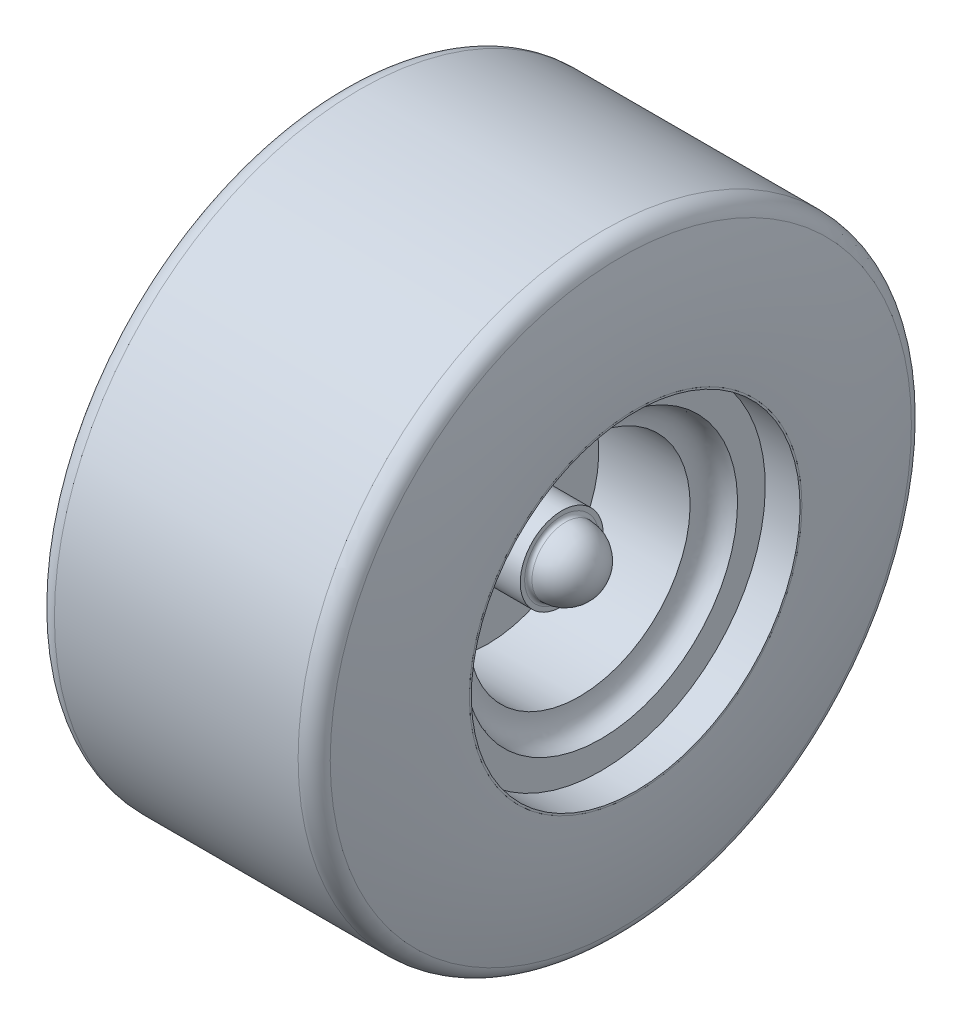
ISO-10303-21;
HEADER;
FILE_DESCRIPTION(('STEP AP214'),'2;1');
FILE_NAME('part.step','',(''),(''),'','','');
FILE_SCHEMA(('AUTOMOTIVE_DESIGN { 1 0 10303 214 1 1 1 1 }'));
ENDSEC;
DATA;
#1=APPLICATION_CONTEXT('core data for automotive mechanical design processes');
#2=APPLICATION_PROTOCOL_DEFINITION('international standard','automotive_design',2000,#1);
#3=PRODUCT_CONTEXT('',#1,'mechanical');
#4=PRODUCT('Part','Part','',(#3));
#5=PRODUCT_RELATED_PRODUCT_CATEGORY('part','',(#4));
#6=PRODUCT_DEFINITION_FORMATION('','',#4);
#7=PRODUCT_DEFINITION_CONTEXT('part definition',#1,'design');
#8=PRODUCT_DEFINITION('design','',#6,#7);
#9=PRODUCT_DEFINITION_SHAPE('','',#8);
#10=(LENGTH_UNIT() NAMED_UNIT(*) SI_UNIT(.MILLI.,.METRE.));
#11=(NAMED_UNIT(*) PLANE_ANGLE_UNIT() SI_UNIT($,.RADIAN.));
#12=(NAMED_UNIT(*) SI_UNIT($,.STERADIAN.) SOLID_ANGLE_UNIT());
#13=UNCERTAINTY_MEASURE_WITH_UNIT(LENGTH_MEASURE(1.E-05),#10,'distance_accuracy_value','');
#14=(GEOMETRIC_REPRESENTATION_CONTEXT(3) GLOBAL_UNCERTAINTY_ASSIGNED_CONTEXT((#13)) GLOBAL_UNIT_ASSIGNED_CONTEXT((#10,
#11,#12)) REPRESENTATION_CONTEXT('',''));
#15=CARTESIAN_POINT('',(0.,0.,0.));
#16=DIRECTION('',(0.,0.,1.));
#17=DIRECTION('',(1.,0.,0.));
#18=AXIS2_PLACEMENT_3D('',#15,#16,#17);
#19=CARTESIAN_POINT('',(-80.9625,0.,0.));
#20=DIRECTION('',(1.,0.,0.));
#21=DIRECTION('',(0.,0.,-1.));
#22=AXIS2_PLACEMENT_3D('',#19,#20,#21);
#23=CYLINDRICAL_SURFACE('',#22,19.05);
#24=CARTESIAN_POINT('',(-80.9625,0.,0.));
#25=DIRECTION('',(-1.,0.,0.));
#26=DIRECTION('',(0.,0.,1.));
#27=AXIS2_PLACEMENT_3D('',#24,#25,#26);
#28=CIRCLE('',#27,19.05);
#29=CARTESIAN_POINT('',(-80.9625,0.,19.05));
#30=VERTEX_POINT('',#29);
#31=EDGE_CURVE('E11',#30,#30,#28,.T.);
#32=ORIENTED_EDGE('',*,*,#31,.F.);
#33=EDGE_LOOP('',(#32));
#34=FACE_BOUND('',#33,.T.);
#35=CARTESIAN_POINT('',(-17.4625,0.,0.));
#36=DIRECTION('',(-1.,0.,0.));
#37=DIRECTION('',(0.,0.,1.));
#38=AXIS2_PLACEMENT_3D('',#35,#36,#37);
#39=CIRCLE('',#38,19.05);
#40=CARTESIAN_POINT('',(-17.4625,0.,19.05));
#41=VERTEX_POINT('',#40);
#42=EDGE_CURVE('E44',#41,#41,#39,.T.);
#43=ORIENTED_EDGE('',*,*,#42,.T.);
#44=EDGE_LOOP('',(#43));
#45=FACE_BOUND('',#44,.T.);
#46=ADVANCED_FACE('F41',(#34,#45),#23,.T.);
#47=CARTESIAN_POINT('',(-80.9625,0.,0.));
#48=DIRECTION('',(-1.,0.,0.));
#49=DIRECTION('',(0.,0.,1.));
#50=AXIS2_PLACEMENT_3D('',#47,#48,#49);
#51=PLANE('',#50);
#52=ORIENTED_EDGE('',*,*,#31,.T.);
#53=EDGE_LOOP('',(#52));
#54=FACE_BOUND('',#53,.T.);
#55=ADVANCED_FACE('F56',(#54),#51,.T.);
#56=CARTESIAN_POINT('',(-17.4625,0.,0.));
#57=DIRECTION('',(-1.,0.,0.));
#58=DIRECTION('',(0.,0.,1.));
#59=AXIS2_PLACEMENT_3D('',#56,#57,#58);
#60=PLANE('',#59);
#61=ORIENTED_EDGE('',*,*,#42,.F.);
#62=EDGE_LOOP('',(#61));
#63=FACE_BOUND('',#62,.T.);
#64=ADVANCED_FACE('F54',(#63),#60,.F.);
#65=CLOSED_SHELL('',(#46,#55,#64));
#66=MANIFOLD_SOLID_BREP('B2',#65);
#67=CARTESIAN_POINT('',(55.5625,0.,0.));
#68=DIRECTION('',(1.,0.,0.));
#69=DIRECTION('',(0.,1.,0.));
#70=AXIS2_PLACEMENT_3D('',#67,#68,#69);
#71=PLANE('',#70);
#72=CARTESIAN_POINT('',(55.5625,0.,0.));
#73=DIRECTION('',(1.,0.,0.));
#74=DIRECTION('',(0.,1.,0.));
#75=AXIS2_PLACEMENT_3D('',#72,#73,#74);
#76=CIRCLE('',#75,25.5647473352489);
#77=CARTESIAN_POINT('',(55.5625,25.5647473352489,0.));
#78=VERTEX_POINT('',#77);
#79=EDGE_CURVE('E40',#78,#78,#76,.F.);
#80=ORIENTED_EDGE('',*,*,#79,.T.);
#81=EDGE_LOOP('',(#80));
#82=FACE_BOUND('',#81,.T.);
#83=CARTESIAN_POINT('',(55.5625,0.,0.));
#84=DIRECTION('',(1.,0.,0.));
#85=DIRECTION('',(0.,1.,0.));
#86=AXIS2_PLACEMENT_3D('',#83,#84,#85);
#87=CIRCLE('',#86,28.575);
#88=CARTESIAN_POINT('',(55.5625,28.575,0.));
#89=VERTEX_POINT('',#88);
#90=EDGE_CURVE('E96',#89,#89,#87,.T.);
#91=ORIENTED_EDGE('',*,*,#90,.T.);
#92=EDGE_LOOP('',(#91));
#93=FACE_BOUND('',#92,.T.);
#94=ADVANCED_FACE('F89',(#82,#93),#71,.T.);
#95=CARTESIAN_POINT('',(55.5625,0.,0.));
#96=DIRECTION('',(-1.,0.,0.));
#97=DIRECTION('',(0.,-1.,0.));
#98=AXIS2_PLACEMENT_3D('',#95,#96,#97);
#99=CYLINDRICAL_SURFACE('',#98,28.575);
#100=ORIENTED_EDGE('',*,*,#90,.F.);
#101=EDGE_LOOP('',(#100));
#102=FACE_BOUND('',#101,.T.);
#103=CARTESIAN_POINT('',(4.7625,0.,0.));
#104=DIRECTION('',(1.,0.,0.));
#105=DIRECTION('',(0.,1.,0.));
#106=AXIS2_PLACEMENT_3D('',#103,#104,#105);
#107=CIRCLE('',#106,28.575);
#108=CARTESIAN_POINT('',(4.7625,28.575,0.));
#109=VERTEX_POINT('',#108);
#110=EDGE_CURVE('E100',#109,#109,#107,.T.);
#111=ORIENTED_EDGE('',*,*,#110,.T.);
#112=EDGE_LOOP('',(#111));
#113=FACE_BOUND('',#112,.T.);
#114=ADVANCED_FACE('F119',(#102,#113),#99,.T.);
#115=CARTESIAN_POINT('',(4.7625,0.,0.));
#116=DIRECTION('',(1.,0.,0.));
#117=DIRECTION('',(0.,1.,0.));
#118=AXIS2_PLACEMENT_3D('',#115,#116,#117);
#119=PLANE('',#118);
#120=ORIENTED_EDGE('',*,*,#110,.F.);
#121=EDGE_LOOP('',(#120));
#122=FACE_BOUND('',#121,.T.);
#123=ADVANCED_FACE('F117',(#122),#119,.F.);
#124=CARTESIAN_POINT('',(57.9371590146096,0.,0.));
#125=DIRECTION('',(0.,0.,1.));
#126=DIRECTION('',(1.,0.,0.));
#127=AXIS2_PLACEMENT_3D('',#124,#125,#126);
#128=SPHERICAL_SURFACE('',#127,23.0253409853904);
#129=CARTESIAN_POINT('',(57.9371590146096,0.,0.));
#130=DIRECTION('',(1.,0.,0.));
#131=DIRECTION('',(0.,1.,0.));
#132=AXIS2_PLACEMENT_3D('',#129,#130,#131);
#133=SPHERICAL_SURFACE('',#132,23.0253409853904);
#134=CARTESIAN_POINT('',(58.1025,0.,0.));
#135=DIRECTION('',(1.,0.,0.));
#136=DIRECTION('',(0.,1.,0.));
#137=AXIS2_PLACEMENT_3D('',#134,#135,#136);
#138=CIRCLE('',#137,23.0247473352489);
#139=CARTESIAN_POINT('',(58.1025,23.0247473352489,0.));
#140=VERTEX_POINT('',#139);
#141=EDGE_CURVE('E105',#140,#140,#138,.T.);
#142=ORIENTED_EDGE('',*,*,#141,.T.);
#143=EDGE_LOOP('',(#142));
#144=FACE_BOUND('',#143,.T.);
#145=ADVANCED_FACE('F110',(#144),#133,.T.);
#146=CARTESIAN_POINT('',(58.1025,0.,0.));
#147=DIRECTION('',(1.,0.,0.));
#148=DIRECTION('',(0.,1.,0.));
#149=AXIS2_PLACEMENT_3D('',#146,#147,#148);
#150=TOROIDAL_SURFACE('',#149,25.5647473352489,2.54);
#151=ORIENTED_EDGE('',*,*,#79,.F.);
#152=EDGE_LOOP('',(#151));
#153=FACE_BOUND('',#152,.T.);
#154=ORIENTED_EDGE('',*,*,#141,.F.);
#155=EDGE_LOOP('',(#154));
#156=FACE_BOUND('',#155,.T.);
#157=ADVANCED_FACE('F91',(#153,#156),#150,.F.);
#158=CLOSED_SHELL('',(#94,#114,#123,#145,#157));
#159=MANIFOLD_SOLID_BREP('B6',#158);
#160=CARTESIAN_POINT('',(-17.4625,0.,0.));
#161=DIRECTION('',(-1.,0.,0.));
#162=DIRECTION('',(0.,0.,1.));
#163=AXIS2_PLACEMENT_3D('',#160,#161,#162);
#164=PLANE('',#163);
#165=CARTESIAN_POINT('',(-17.4625,0.,0.));
#166=DIRECTION('',(1.,0.,0.));
#167=DIRECTION('',(0.,0.,-1.));
#168=AXIS2_PLACEMENT_3D('',#165,#166,#167);
#169=CIRCLE('',#168,96.9151830966365);
#170=CARTESIAN_POINT('',(-17.4625,0.,-96.9151830966365));
#171=VERTEX_POINT('',#170);
#172=EDGE_CURVE('E88',#171,#171,#169,.T.);
#173=ORIENTED_EDGE('',*,*,#172,.F.);
#174=EDGE_LOOP('',(#173));
#175=FACE_BOUND('',#174,.T.);
#176=ADVANCED_FACE('F166',(#175),#164,.T.);
#177=CARTESIAN_POINT('',(0.,0.,0.));
#178=DIRECTION('',(1.,0.,0.));
#179=DIRECTION('',(0.,0.,-1.));
#180=AXIS2_PLACEMENT_3D('',#177,#178,#179);
#181=CYLINDRICAL_SURFACE('',#180,96.9151830966365);
#182=ORIENTED_EDGE('',*,*,#172,.T.);
#183=EDGE_LOOP('',(#182));
#184=FACE_BOUND('',#183,.T.);
#185=CARTESIAN_POINT('',(-90.2476830966366,0.,0.));
#186=DIRECTION('',(1.,0.,0.));
#187=DIRECTION('',(0.,0.,-1.));
#188=AXIS2_PLACEMENT_3D('',#185,#186,#187);
#189=CIRCLE('',#188,96.9151830966365);
#190=CARTESIAN_POINT('',(-90.2476830966366,0.,-96.9151830966365));
#191=VERTEX_POINT('',#190);
#192=EDGE_CURVE('E172',#191,#191,#189,.T.);
#193=ORIENTED_EDGE('',*,*,#192,.F.);
#194=EDGE_LOOP('',(#193));
#195=FACE_BOUND('',#194,.T.);
#196=ADVANCED_FACE('F246',(#184,#195),#181,.F.);
#197=CARTESIAN_POINT('',(-101.760694514085,0.,0.));
#198=DIRECTION('',(-1.,0.,0.));
#199=DIRECTION('',(0.,0.,1.));
#200=AXIS2_PLACEMENT_3D('',#197,#198,#199);
#201=CONICAL_SURFACE('',#200,113.03,0.950447084238589);
#202=ORIENTED_EDGE('',*,*,#192,.T.);
#203=EDGE_LOOP('',(#202));
#204=FACE_BOUND('',#203,.T.);
#205=CARTESIAN_POINT('',(-101.760694514085,0.,0.));
#206=DIRECTION('',(1.,0.,0.));
#207=DIRECTION('',(0.,0.,-1.));
#208=AXIS2_PLACEMENT_3D('',#205,#206,#207);
#209=CIRCLE('',#208,113.03);
#210=CARTESIAN_POINT('',(-101.760694514085,0.,-113.03));
#211=VERTEX_POINT('',#210);
#212=EDGE_CURVE('E176',#211,#211,#209,.T.);
#213=ORIENTED_EDGE('',*,*,#212,.F.);
#214=EDGE_LOOP('',(#213));
#215=FACE_BOUND('',#214,.T.);
#216=ADVANCED_FACE('F243',(#204,#215),#201,.F.);
#217=CARTESIAN_POINT('',(0.,0.,0.));
#218=DIRECTION('',(1.,0.,0.));
#219=DIRECTION('',(0.,0.,-1.));
#220=AXIS2_PLACEMENT_3D('',#217,#218,#219);
#221=CYLINDRICAL_SURFACE('',#220,113.03);
#222=ORIENTED_EDGE('',*,*,#212,.T.);
#223=EDGE_LOOP('',(#222));
#224=FACE_BOUND('',#223,.T.);
#225=CARTESIAN_POINT('',(-106.3625,0.,0.));
#226=DIRECTION('',(1.,0.,0.));
#227=DIRECTION('',(0.,0.,-1.));
#228=AXIS2_PLACEMENT_3D('',#225,#226,#227);
#229=CIRCLE('',#228,113.03);
#230=CARTESIAN_POINT('',(-106.3625,0.,-113.03));
#231=VERTEX_POINT('',#230);
#232=EDGE_CURVE('E180',#231,#231,#229,.T.);
#233=ORIENTED_EDGE('',*,*,#232,.F.);
#234=EDGE_LOOP('',(#233));
#235=FACE_BOUND('',#234,.T.);
#236=ADVANCED_FACE('F239',(#224,#235),#221,.F.);
#237=CARTESIAN_POINT('',(-106.3625,114.3,0.));
#238=DIRECTION('',(-1.,0.,0.));
#239=DIRECTION('',(0.,0.,1.));
#240=AXIS2_PLACEMENT_3D('',#237,#238,#239);
#241=PLANE('',#240);
#242=ORIENTED_EDGE('',*,*,#232,.T.);
#243=EDGE_LOOP('',(#242));
#244=FACE_BOUND('',#243,.T.);
#245=CARTESIAN_POINT('',(-106.3625,0.,0.));
#246=DIRECTION('',(1.,0.,0.));
#247=DIRECTION('',(0.,0.,-1.));
#248=AXIS2_PLACEMENT_3D('',#245,#246,#247);
#249=CIRCLE('',#248,114.3);
#250=CARTESIAN_POINT('',(-106.3625,0.,-114.3));
#251=VERTEX_POINT('',#250);
#252=EDGE_CURVE('E185',#251,#251,#249,.T.);
#253=ORIENTED_EDGE('',*,*,#252,.F.);
#254=EDGE_LOOP('',(#253));
#255=FACE_BOUND('',#254,.T.);
#256=ADVANCED_FACE('F235',(#244,#255),#241,.T.);
#257=CARTESIAN_POINT('',(0.,0.,0.));
#258=DIRECTION('',(1.,0.,0.));
#259=DIRECTION('',(0.,0.,-1.));
#260=AXIS2_PLACEMENT_3D('',#257,#258,#259);
#261=CYLINDRICAL_SURFACE('',#260,114.3);
#262=ORIENTED_EDGE('',*,*,#252,.T.);
#263=EDGE_LOOP('',(#262));
#264=FACE_BOUND('',#263,.T.);
#265=CARTESIAN_POINT('',(106.3625,0.,0.));
#266=DIRECTION('',(-1.,0.,0.));
#267=DIRECTION('',(0.,-1.,0.));
#268=AXIS2_PLACEMENT_3D('',#265,#266,#267);
#269=CIRCLE('',#268,114.3);
#270=CARTESIAN_POINT('',(106.3625,-114.3,0.));
#271=VERTEX_POINT('',#270);
#272=EDGE_CURVE('E188',#271,#271,#269,.T.);
#273=ORIENTED_EDGE('',*,*,#272,.T.);
#274=EDGE_LOOP('',(#273));
#275=FACE_BOUND('',#274,.T.);
#276=ADVANCED_FACE('F231',(#264,#275),#261,.T.);
#277=CARTESIAN_POINT('',(106.3625,114.3,0.));
#278=DIRECTION('',(-1.,0.,0.));
#279=DIRECTION('',(0.,-1.,0.));
#280=AXIS2_PLACEMENT_3D('',#277,#278,#279);
#281=PLANE('',#280);
#282=ORIENTED_EDGE('',*,*,#272,.F.);
#283=EDGE_LOOP('',(#282));
#284=FACE_BOUND('',#283,.T.);
#285=CARTESIAN_POINT('',(106.3625,0.,0.));
#286=DIRECTION('',(-1.,0.,0.));
#287=DIRECTION('',(0.,-1.,0.));
#288=AXIS2_PLACEMENT_3D('',#285,#286,#287);
#289=CIRCLE('',#288,113.03);
#290=CARTESIAN_POINT('',(106.3625,-113.03,0.));
#291=VERTEX_POINT('',#290);
#292=EDGE_CURVE('E203',#291,#291,#289,.T.);
#293=ORIENTED_EDGE('',*,*,#292,.T.);
#294=EDGE_LOOP('',(#293));
#295=FACE_BOUND('',#294,.T.);
#296=ADVANCED_FACE('F227',(#284,#295),#281,.F.);
#297=CARTESIAN_POINT('',(4.76249999999999,76.2,0.));
#298=DIRECTION('',(-1.,0.,0.));
#299=DIRECTION('',(0.,-1.,0.));
#300=AXIS2_PLACEMENT_3D('',#297,#298,#299);
#301=PLANE('',#300);
#302=CARTESIAN_POINT('',(4.76249999999999,0.,0.));
#303=DIRECTION('',(-1.,0.,0.));
#304=DIRECTION('',(0.,-1.,0.));
#305=AXIS2_PLACEMENT_3D('',#302,#303,#304);
#306=CIRCLE('',#305,76.2);
#307=CARTESIAN_POINT('',(4.76249999999999,-76.2,0.));
#308=VERTEX_POINT('',#307);
#309=EDGE_CURVE('E191',#308,#308,#306,.T.);
#310=ORIENTED_EDGE('',*,*,#309,.F.);
#311=EDGE_LOOP('',(#310));
#312=FACE_BOUND('',#311,.T.);
#313=ADVANCED_FACE('F223',(#312),#301,.F.);
#314=CARTESIAN_POINT('',(4.7625,0.,0.));
#315=DIRECTION('',(-1.,0.,0.));
#316=DIRECTION('',(0.,-1.,0.));
#317=AXIS2_PLACEMENT_3D('',#314,#315,#316);
#318=CYLINDRICAL_SURFACE('',#317,76.2);
#319=CARTESIAN_POINT('',(67.5831908475519,0.,0.));
#320=DIRECTION('',(-1.,0.,0.));
#321=DIRECTION('',(0.,-1.,0.));
#322=AXIS2_PLACEMENT_3D('',#319,#320,#321);
#323=CIRCLE('',#322,76.2);
#324=CARTESIAN_POINT('',(67.5831908475519,-76.2,0.));
#325=VERTEX_POINT('',#324);
#326=EDGE_CURVE('E194',#325,#325,#323,.T.);
#327=ORIENTED_EDGE('',*,*,#326,.F.);
#328=EDGE_LOOP('',(#327));
#329=FACE_BOUND('',#328,.T.);
#330=ORIENTED_EDGE('',*,*,#309,.T.);
#331=EDGE_LOOP('',(#330));
#332=FACE_BOUND('',#331,.T.);
#333=ADVANCED_FACE('F218',(#329,#332),#318,.F.);
#334=CARTESIAN_POINT('',(67.5831908475519,76.2,0.));
#335=CARTESIAN_POINT('',(67.3974145658401,92.7891350526646,0.));
#336=CARTESIAN_POINT('',(82.4395260373512,93.98,0.));
#337=B_SPLINE_CURVE_WITH_KNOTS('',2,(#334,#335,#336),.UNSPECIFIED.,.F.,.F.,(3,3),(0.,1.),.UNSPECIFIED.);
#338=CARTESIAN_POINT('',(4.7625,0.,0.));
#339=DIRECTION('',(-1.,0.,0.));
#340=AXIS1_PLACEMENT('',#338,#339);
#341=SURFACE_OF_REVOLUTION('',#337,#340);
#342=CARTESIAN_POINT('',(82.4395260373512,0.,0.));
#343=DIRECTION('',(-1.,0.,0.));
#344=DIRECTION('',(0.,-1.,0.));
#345=AXIS2_PLACEMENT_3D('',#342,#343,#344);
#346=CIRCLE('',#345,93.98);
#347=CARTESIAN_POINT('',(82.4395260373512,-93.98,0.));
#348=VERTEX_POINT('',#347);
#349=EDGE_CURVE('E197',#348,#348,#346,.T.);
#350=ORIENTED_EDGE('',*,*,#349,.F.);
#351=EDGE_LOOP('',(#350));
#352=FACE_BOUND('',#351,.T.);
#353=ORIENTED_EDGE('',*,*,#326,.T.);
#354=EDGE_LOOP('',(#353));
#355=FACE_BOUND('',#354,.T.);
#356=ADVANCED_FACE('F213',(#352,#355),#341,.T.);
#357=CARTESIAN_POINT('',(82.4395260373512,113.03,0.));
#358=DIRECTION('',(-1.,0.,0.));
#359=DIRECTION('',(0.,-1.,0.));
#360=AXIS2_PLACEMENT_3D('',#357,#358,#359);
#361=PLANE('',#360);
#362=CARTESIAN_POINT('',(82.4395260373512,0.,0.));
#363=DIRECTION('',(-1.,0.,0.));
#364=DIRECTION('',(0.,-1.,0.));
#365=AXIS2_PLACEMENT_3D('',#362,#363,#364);
#366=CIRCLE('',#365,113.03);
#367=CARTESIAN_POINT('',(82.4395260373512,-113.03,0.));
#368=VERTEX_POINT('',#367);
#369=EDGE_CURVE('E200',#368,#368,#366,.T.);
#370=ORIENTED_EDGE('',*,*,#369,.F.);
#371=EDGE_LOOP('',(#370));
#372=FACE_BOUND('',#371,.T.);
#373=ORIENTED_EDGE('',*,*,#349,.T.);
#374=EDGE_LOOP('',(#373));
#375=FACE_BOUND('',#374,.T.);
#376=ADVANCED_FACE('F217',(#372,#375),#361,.F.);
#377=CARTESIAN_POINT('',(4.7625,0.,0.));
#378=DIRECTION('',(-1.,0.,0.));
#379=DIRECTION('',(0.,-1.,0.));
#380=AXIS2_PLACEMENT_3D('',#377,#378,#379);
#381=CYLINDRICAL_SURFACE('',#380,113.03);
#382=ORIENTED_EDGE('',*,*,#292,.F.);
#383=EDGE_LOOP('',(#382));
#384=FACE_BOUND('',#383,.T.);
#385=ORIENTED_EDGE('',*,*,#369,.T.);
#386=EDGE_LOOP('',(#385));
#387=FACE_BOUND('',#386,.T.);
#388=ADVANCED_FACE('F317',(#384,#387),#381,.F.);
#389=CLOSED_SHELL('',(#176,#196,#216,#236,#256,#276,#296,#313,#333,#356,#376,#388));
#390=MANIFOLD_SOLID_BREP('B35',#389);
#391=CARTESIAN_POINT('',(0.,0.,0.));
#392=DIRECTION('',(-1.,0.,0.));
#393=DIRECTION('',(0.,0.,1.));
#394=AXIS2_PLACEMENT_3D('',#391,#392,#393);
#395=CYLINDRICAL_SURFACE('',#394,114.3);
#396=CARTESIAN_POINT('',(106.3625,0.,0.));
#397=DIRECTION('',(-1.,0.,0.));
#398=DIRECTION('',(0.,0.,1.));
#399=AXIS2_PLACEMENT_3D('',#396,#397,#398);
#400=CIRCLE('',#399,114.3);
#401=CARTESIAN_POINT('',(106.3625,0.,114.3));
#402=VERTEX_POINT('',#401);
#403=EDGE_CURVE('E371',#402,#402,#400,.T.);
#404=ORIENTED_EDGE('',*,*,#403,.F.);
#405=EDGE_LOOP('',(#404));
#406=FACE_BOUND('',#405,.T.);
#407=CARTESIAN_POINT('',(-106.3625,0.,0.));
#408=DIRECTION('',(-1.,0.,0.));
#409=DIRECTION('',(0.,0.,1.));
#410=AXIS2_PLACEMENT_3D('',#407,#408,#409);
#411=CIRCLE('',#410,114.3);
#412=CARTESIAN_POINT('',(-106.3625,0.,114.3));
#413=VERTEX_POINT('',#412);
#414=EDGE_CURVE('E374',#413,#413,#411,.T.);
#415=ORIENTED_EDGE('',*,*,#414,.T.);
#416=EDGE_LOOP('',(#415));
#417=FACE_BOUND('',#416,.T.);
#418=ADVANCED_FACE('F351',(#406,#417),#395,.F.);
#419=CARTESIAN_POINT('',(106.3625,114.3,0.));
#420=CARTESIAN_POINT('',(106.3625,162.346468392588,0.));
#421=CARTESIAN_POINT('',(93.6625,209.55,0.));
#422=B_SPLINE_CURVE_WITH_KNOTS('',2,(#419,#420,#421),.UNSPECIFIED.,.F.,.F.,(3,3),(0.,1.),.UNSPECIFIED.);
#423=CARTESIAN_POINT('',(0.,0.,0.));
#424=DIRECTION('',(-1.,0.,0.));
#425=AXIS1_PLACEMENT('',#423,#424);
#426=SURFACE_OF_REVOLUTION('',#422,#425);
#427=CARTESIAN_POINT('',(96.1421889415925,0.,0.));
#428=DIRECTION('',(-1.,0.,0.));
#429=DIRECTION('',(0.,0.,1.));
#430=AXIS2_PLACEMENT_3D('',#427,#428,#429);
#431=CIRCLE('',#430,199.824505172912);
#432=CARTESIAN_POINT('',(96.1421889415925,0.,199.824505172912));
#433=VERTEX_POINT('',#432);
#434=EDGE_CURVE('E358',#433,#433,#431,.F.);
#435=ORIENTED_EDGE('',*,*,#434,.T.);
#436=EDGE_LOOP('',(#435));
#437=FACE_BOUND('',#436,.T.);
#438=ORIENTED_EDGE('',*,*,#403,.T.);
#439=EDGE_LOOP('',(#438));
#440=FACE_BOUND('',#439,.T.);
#441=ADVANCED_FACE('F384',(#437,#440),#426,.T.);
#442=CARTESIAN_POINT('',(0.,0.,0.));
#443=DIRECTION('',(-1.,0.,0.));
#444=DIRECTION('',(0.,0.,1.));
#445=AXIS2_PLACEMENT_3D('',#442,#443,#444);
#446=CYLINDRICAL_SURFACE('',#445,209.55);
#447=CARTESIAN_POINT('',(83.7954355636264,0.,0.));
#448=DIRECTION('',(1.,0.,0.));
#449=DIRECTION('',(0.,0.,-1.));
#450=AXIS2_PLACEMENT_3D('',#447,#448,#449);
#451=CIRCLE('',#450,209.55);
#452=CARTESIAN_POINT('',(83.7954355636264,0.,-209.55));
#453=VERTEX_POINT('',#452);
#454=EDGE_CURVE('E362',#453,#453,#451,.F.);
#455=ORIENTED_EDGE('',*,*,#454,.T.);
#456=EDGE_LOOP('',(#455));
#457=FACE_BOUND('',#456,.T.);
#458=CARTESIAN_POINT('',(-83.7954355636264,0.,0.));
#459=DIRECTION('',(1.,0.,0.));
#460=DIRECTION('',(0.,0.,-1.));
#461=AXIS2_PLACEMENT_3D('',#458,#459,#460);
#462=CIRCLE('',#461,209.55);
#463=CARTESIAN_POINT('',(-83.7954355636264,0.,-209.55));
#464=VERTEX_POINT('',#463);
#465=EDGE_CURVE('E366',#464,#464,#462,.T.);
#466=ORIENTED_EDGE('',*,*,#465,.T.);
#467=EDGE_LOOP('',(#466));
#468=FACE_BOUND('',#467,.T.);
#469=ADVANCED_FACE('F388',(#457,#468),#446,.T.);
#470=CARTESIAN_POINT('',(-106.3625,114.3,0.));
#471=CARTESIAN_POINT('',(-106.3625,162.346468392588,0.));
#472=CARTESIAN_POINT('',(-93.6625,209.55,0.));
#473=B_SPLINE_CURVE_WITH_KNOTS('',2,(#470,#471,#472),.UNSPECIFIED.,.F.,.F.,(3,3),(0.,1.),.UNSPECIFIED.);
#474=CARTESIAN_POINT('',(0.,0.,0.));
#475=DIRECTION('',(1.,0.,0.));
#476=AXIS1_PLACEMENT('',#474,#475);
#477=SURFACE_OF_REVOLUTION('',#473,#476);
#478=CARTESIAN_POINT('',(-96.1421889415925,0.,0.));
#479=DIRECTION('',(1.,0.,0.));
#480=DIRECTION('',(0.,0.,-1.));
#481=AXIS2_PLACEMENT_3D('',#478,#479,#480);
#482=CIRCLE('',#481,199.824505172913);
#483=CARTESIAN_POINT('',(-96.1421889415925,0.,-199.824505172913));
#484=VERTEX_POINT('',#483);
#485=EDGE_CURVE('E165',#484,#484,#482,.F.);
#486=ORIENTED_EDGE('',*,*,#485,.T.);
#487=EDGE_LOOP('',(#486));
#488=FACE_BOUND('',#487,.T.);
#489=ORIENTED_EDGE('',*,*,#414,.F.);
#490=EDGE_LOOP('',(#489));
#491=FACE_BOUND('',#490,.T.);
#492=ADVANCED_FACE('F394',(#488,#491),#477,.T.);
#493=CARTESIAN_POINT('',(83.7954355636264,0.,0.));
#494=DIRECTION('',(1.,0.,0.));
#495=DIRECTION('',(0.,0.,-1.));
#496=AXIS2_PLACEMENT_3D('',#493,#494,#495);
#497=TOROIDAL_SURFACE('',#496,196.85,12.7);
#498=ORIENTED_EDGE('',*,*,#434,.F.);
#499=EDGE_LOOP('',(#498));
#500=FACE_BOUND('',#499,.T.);
#501=ORIENTED_EDGE('',*,*,#454,.F.);
#502=EDGE_LOOP('',(#501));
#503=FACE_BOUND('',#502,.T.);
#504=ADVANCED_FACE('F392',(#500,#503),#497,.T.);
#505=CARTESIAN_POINT('',(-83.7954355636264,0.,0.));
#506=DIRECTION('',(1.,0.,0.));
#507=DIRECTION('',(0.,0.,-1.));
#508=AXIS2_PLACEMENT_3D('',#505,#506,#507);
#509=TOROIDAL_SURFACE('',#508,196.85,12.7);
#510=ORIENTED_EDGE('',*,*,#465,.F.);
#511=EDGE_LOOP('',(#510));
#512=FACE_BOUND('',#511,.T.);
#513=ORIENTED_EDGE('',*,*,#485,.F.);
#514=EDGE_LOOP('',(#513));
#515=FACE_BOUND('',#514,.T.);
#516=ADVANCED_FACE('F353',(#512,#515),#509,.T.);
#517=CLOSED_SHELL('',(#418,#441,#469,#492,#504,#516));
#518=MANIFOLD_SOLID_BREP('B83',#517);
#519=ADVANCED_BREP_SHAPE_REPRESENTATION('',(#18,#66,#159,#390,#518),#14);
#520=SHAPE_DEFINITION_REPRESENTATION(#9,#519);
ENDSEC;
END-ISO-10303-21;
